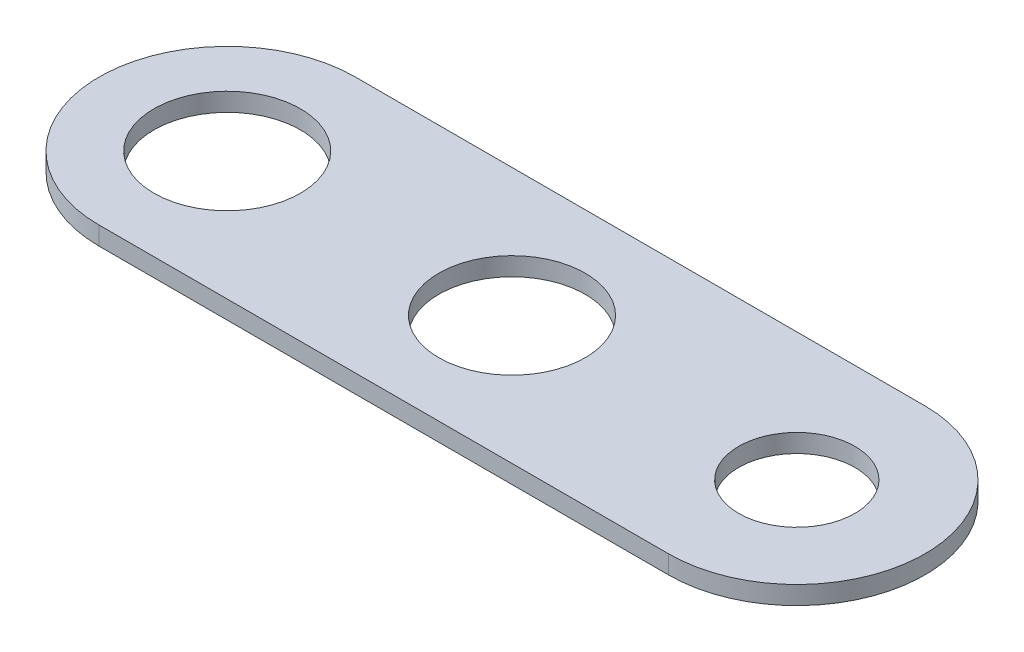
ISO-10303-21;
HEADER;
FILE_DESCRIPTION(('STEP AP214'),'2;1');
FILE_NAME('part.step','',(''),(''),'','','');
FILE_SCHEMA(('AUTOMOTIVE_DESIGN { 1 0 10303 214 1 1 1 1 }'));
ENDSEC;
DATA;
#1=APPLICATION_CONTEXT('core data for automotive mechanical design processes');
#2=APPLICATION_PROTOCOL_DEFINITION('international standard','automotive_design',2000,#1);
#3=PRODUCT_CONTEXT('',#1,'mechanical');
#4=PRODUCT('Part','Part','',(#3));
#5=PRODUCT_RELATED_PRODUCT_CATEGORY('part','',(#4));
#6=PRODUCT_DEFINITION_FORMATION('','',#4);
#7=PRODUCT_DEFINITION_CONTEXT('part definition',#1,'design');
#8=PRODUCT_DEFINITION('design','',#6,#7);
#9=PRODUCT_DEFINITION_SHAPE('','',#8);
#10=(LENGTH_UNIT() NAMED_UNIT(*) SI_UNIT(.MILLI.,.METRE.));
#11=(NAMED_UNIT(*) PLANE_ANGLE_UNIT() SI_UNIT($,.RADIAN.));
#12=(NAMED_UNIT(*) SI_UNIT($,.STERADIAN.) SOLID_ANGLE_UNIT());
#13=UNCERTAINTY_MEASURE_WITH_UNIT(LENGTH_MEASURE(1.E-05),#10,'distance_accuracy_value','');
#14=(GEOMETRIC_REPRESENTATION_CONTEXT(3) GLOBAL_UNCERTAINTY_ASSIGNED_CONTEXT((#13)) GLOBAL_UNIT_ASSIGNED_CONTEXT((#10,
#11,#12)) REPRESENTATION_CONTEXT('',''));
#15=CARTESIAN_POINT('',(0.,0.,0.));
#16=DIRECTION('',(0.,0.,1.));
#17=DIRECTION('',(1.,0.,0.));
#18=AXIS2_PLACEMENT_3D('',#15,#16,#17);
#19=CARTESIAN_POINT('',(-15.555,1.,0.));
#20=DIRECTION('',(0.,1.,0.));
#21=DIRECTION('',(0.,0.,1.));
#22=AXIS2_PLACEMENT_3D('',#19,#20,#21);
#23=PLANE('',#22);
#24=CARTESIAN_POINT('',(0.,1.,0.));
#25=DIRECTION('',(0.,1.,0.));
#26=DIRECTION('',(0.,0.,1.));
#27=AXIS2_PLACEMENT_3D('',#24,#25,#26);
#28=CIRCLE('',#27,4.);
#29=CARTESIAN_POINT('',(0.,1.,4.));
#30=VERTEX_POINT('',#29);
#31=EDGE_CURVE('E115',#30,#30,#28,.T.);
#32=ORIENTED_EDGE('',*,*,#31,.F.);
#33=EDGE_LOOP('',(#32));
#34=FACE_BOUND('',#33,.T.);
#35=CARTESIAN_POINT('',(-15.555,1.,0.));
#36=DIRECTION('',(0.,1.,0.));
#37=DIRECTION('',(0.,0.,1.));
#38=AXIS2_PLACEMENT_3D('',#35,#36,#37);
#39=CIRCLE('',#38,7.);
#40=CARTESIAN_POINT('',(-15.555,1.,-7.));
#41=VERTEX_POINT('',#40);
#42=CARTESIAN_POINT('',(-15.555,1.,7.));
#43=VERTEX_POINT('',#42);
#44=EDGE_CURVE('E85',#41,#43,#39,.T.);
#45=ORIENTED_EDGE('',*,*,#44,.T.);
#46=DIRECTION('',(1.,0.,0.));
#47=VECTOR('',#46,1.);
#48=CARTESIAN_POINT('',(-15.555,1.,7.));
#49=LINE('',#48,#47);
#50=CARTESIAN_POINT('',(15.555,1.,6.99999999999999));
#51=VERTEX_POINT('',#50);
#52=EDGE_CURVE('E80',#43,#51,#49,.T.);
#53=ORIENTED_EDGE('',*,*,#52,.T.);
#54=CARTESIAN_POINT('',(15.555,1.,0.));
#55=DIRECTION('',(0.,1.,0.));
#56=DIRECTION('',(0.,0.,1.));
#57=AXIS2_PLACEMENT_3D('',#54,#55,#56);
#58=CIRCLE('',#57,7.);
#59=CARTESIAN_POINT('',(15.555,1.,-7.00000000000001));
#60=VERTEX_POINT('',#59);
#61=EDGE_CURVE('E83',#51,#60,#58,.T.);
#62=ORIENTED_EDGE('',*,*,#61,.T.);
#63=DIRECTION('',(-1.,0.,0.));
#64=VECTOR('',#63,1.);
#65=CARTESIAN_POINT('',(-15.555,1.,-7.));
#66=LINE('',#65,#64);
#67=EDGE_CURVE('E50',#60,#41,#66,.T.);
#68=ORIENTED_EDGE('',*,*,#67,.T.);
#69=EDGE_LOOP('',(#45,#53,#62,#68));
#70=FACE_BOUND('',#69,.T.);
#71=CARTESIAN_POINT('',(-15.555,1.,0.));
#72=DIRECTION('',(0.,1.,0.));
#73=DIRECTION('',(0.,0.,1.));
#74=AXIS2_PLACEMENT_3D('',#71,#72,#73);
#75=CIRCLE('',#74,4.);
#76=CARTESIAN_POINT('',(-15.555,1.,4.));
#77=VERTEX_POINT('',#76);
#78=EDGE_CURVE('E100',#77,#77,#75,.T.);
#79=ORIENTED_EDGE('',*,*,#78,.F.);
#80=EDGE_LOOP('',(#79));
#81=FACE_BOUND('',#80,.T.);
#82=CARTESIAN_POINT('',(15.555,1.,0.));
#83=DIRECTION('',(0.,1.,0.));
#84=DIRECTION('',(0.,0.,1.));
#85=AXIS2_PLACEMENT_3D('',#82,#83,#84);
#86=CIRCLE('',#85,3.175);
#87=CARTESIAN_POINT('',(15.555,1.,3.175));
#88=VERTEX_POINT('',#87);
#89=EDGE_CURVE('E121',#88,#88,#86,.T.);
#90=ORIENTED_EDGE('',*,*,#89,.F.);
#91=EDGE_LOOP('',(#90));
#92=FACE_BOUND('',#91,.T.);
#93=ADVANCED_FACE('F33',(#34,#70,#81,#92),#23,.T.);
#94=CARTESIAN_POINT('',(-15.555,0.,0.));
#95=DIRECTION('',(0.,1.,0.));
#96=DIRECTION('',(0.,0.,1.));
#97=AXIS2_PLACEMENT_3D('',#94,#95,#96);
#98=PLANE('',#97);
#99=CARTESIAN_POINT('',(-15.555,0.,0.));
#100=DIRECTION('',(0.,1.,0.));
#101=DIRECTION('',(0.,0.,1.));
#102=AXIS2_PLACEMENT_3D('',#99,#100,#101);
#103=CIRCLE('',#102,7.);
#104=CARTESIAN_POINT('',(-15.555,0.,-7.));
#105=VERTEX_POINT('',#104);
#106=CARTESIAN_POINT('',(-15.555,0.,7.));
#107=VERTEX_POINT('',#106);
#108=EDGE_CURVE('E97',#105,#107,#103,.T.);
#109=ORIENTED_EDGE('',*,*,#108,.F.);
#110=DIRECTION('',(-1.,0.,0.));
#111=VECTOR('',#110,1.);
#112=CARTESIAN_POINT('',(-15.555,0.,-7.));
#113=LINE('',#112,#111);
#114=CARTESIAN_POINT('',(15.555,0.,-7.00000000000001));
#115=VERTEX_POINT('',#114);
#116=EDGE_CURVE('E73',#115,#105,#113,.T.);
#117=ORIENTED_EDGE('',*,*,#116,.F.);
#118=CARTESIAN_POINT('',(15.555,0.,0.));
#119=DIRECTION('',(0.,1.,0.));
#120=DIRECTION('',(0.,0.,1.));
#121=AXIS2_PLACEMENT_3D('',#118,#119,#120);
#122=CIRCLE('',#121,7.);
#123=CARTESIAN_POINT('',(15.555,0.,6.99999999999999));
#124=VERTEX_POINT('',#123);
#125=EDGE_CURVE('E67',#124,#115,#122,.T.);
#126=ORIENTED_EDGE('',*,*,#125,.F.);
#127=DIRECTION('',(1.,0.,0.));
#128=VECTOR('',#127,1.);
#129=CARTESIAN_POINT('',(-15.555,0.,7.));
#130=LINE('',#129,#128);
#131=EDGE_CURVE('E89',#107,#124,#130,.T.);
#132=ORIENTED_EDGE('',*,*,#131,.F.);
#133=EDGE_LOOP('',(#109,#117,#126,#132));
#134=FACE_BOUND('',#133,.T.);
#135=CARTESIAN_POINT('',(-15.555,0.,0.));
#136=DIRECTION('',(0.,1.,0.));
#137=DIRECTION('',(0.,0.,1.));
#138=AXIS2_PLACEMENT_3D('',#135,#136,#137);
#139=CIRCLE('',#138,4.);
#140=CARTESIAN_POINT('',(-15.555,0.,4.));
#141=VERTEX_POINT('',#140);
#142=EDGE_CURVE('E112',#141,#141,#139,.T.);
#143=ORIENTED_EDGE('',*,*,#142,.T.);
#144=EDGE_LOOP('',(#143));
#145=FACE_BOUND('',#144,.T.);
#146=CARTESIAN_POINT('',(0.,0.,0.));
#147=DIRECTION('',(0.,1.,0.));
#148=DIRECTION('',(0.,0.,1.));
#149=AXIS2_PLACEMENT_3D('',#146,#147,#148);
#150=CIRCLE('',#149,4.);
#151=CARTESIAN_POINT('',(0.,0.,4.));
#152=VERTEX_POINT('',#151);
#153=EDGE_CURVE('E118',#152,#152,#150,.T.);
#154=ORIENTED_EDGE('',*,*,#153,.T.);
#155=EDGE_LOOP('',(#154));
#156=FACE_BOUND('',#155,.T.);
#157=CARTESIAN_POINT('',(15.555,0.,0.));
#158=DIRECTION('',(0.,1.,0.));
#159=DIRECTION('',(0.,0.,1.));
#160=AXIS2_PLACEMENT_3D('',#157,#158,#159);
#161=CIRCLE('',#160,3.175);
#162=CARTESIAN_POINT('',(15.555,0.,3.175));
#163=VERTEX_POINT('',#162);
#164=EDGE_CURVE('E124',#163,#163,#161,.T.);
#165=ORIENTED_EDGE('',*,*,#164,.T.);
#166=EDGE_LOOP('',(#165));
#167=FACE_BOUND('',#166,.T.);
#168=ADVANCED_FACE('F108',(#134,#145,#156,#167),#98,.F.);
#169=CARTESIAN_POINT('',(-15.555,1.,0.));
#170=DIRECTION('',(0.,-1.,0.));
#171=DIRECTION('',(0.,0.,-1.));
#172=AXIS2_PLACEMENT_3D('',#169,#170,#171);
#173=CYLINDRICAL_SURFACE('',#172,7.);
#174=ORIENTED_EDGE('',*,*,#108,.T.);
#175=DIRECTION('',(0.,-1.,0.));
#176=VECTOR('',#175,1.);
#177=CARTESIAN_POINT('',(-15.555,1.,7.));
#178=LINE('',#177,#176);
#179=EDGE_CURVE('E11',#43,#107,#178,.T.);
#180=ORIENTED_EDGE('',*,*,#179,.F.);
#181=ORIENTED_EDGE('',*,*,#44,.F.);
#182=DIRECTION('',(0.,-1.,0.));
#183=VECTOR('',#182,1.);
#184=CARTESIAN_POINT('',(-15.555,1.,-7.));
#185=LINE('',#184,#183);
#186=EDGE_CURVE('E93',#41,#105,#185,.T.);
#187=ORIENTED_EDGE('',*,*,#186,.T.);
#188=EDGE_LOOP('',(#174,#180,#181,#187));
#189=FACE_BOUND('',#188,.T.);
#190=ADVANCED_FACE('F35',(#189),#173,.T.);
#191=CARTESIAN_POINT('',(-15.555,1.,7.));
#192=DIRECTION('',(0.,0.,-1.));
#193=DIRECTION('',(-1.,0.,0.));
#194=AXIS2_PLACEMENT_3D('',#191,#192,#193);
#195=PLANE('',#194);
#196=ORIENTED_EDGE('',*,*,#131,.T.);
#197=DIRECTION('',(0.,-1.,0.));
#198=VECTOR('',#197,1.);
#199=CARTESIAN_POINT('',(15.555,1.,6.99999999999999));
#200=LINE('',#199,#198);
#201=EDGE_CURVE('E42',#51,#124,#200,.T.);
#202=ORIENTED_EDGE('',*,*,#201,.F.);
#203=ORIENTED_EDGE('',*,*,#52,.F.);
#204=ORIENTED_EDGE('',*,*,#179,.T.);
#205=EDGE_LOOP('',(#196,#202,#203,#204));
#206=FACE_BOUND('',#205,.T.);
#207=ADVANCED_FACE('F88',(#206),#195,.F.);
#208=CARTESIAN_POINT('',(15.555,1.,0.));
#209=DIRECTION('',(0.,-1.,0.));
#210=DIRECTION('',(0.,0.,-1.));
#211=AXIS2_PLACEMENT_3D('',#208,#209,#210);
#212=CYLINDRICAL_SURFACE('',#211,7.);
#213=ORIENTED_EDGE('',*,*,#125,.T.);
#214=DIRECTION('',(0.,-1.,0.));
#215=VECTOR('',#214,1.);
#216=CARTESIAN_POINT('',(15.555,1.,-7.00000000000001));
#217=LINE('',#216,#215);
#218=EDGE_CURVE('E90',#60,#115,#217,.T.);
#219=ORIENTED_EDGE('',*,*,#218,.F.);
#220=ORIENTED_EDGE('',*,*,#61,.F.);
#221=ORIENTED_EDGE('',*,*,#201,.T.);
#222=EDGE_LOOP('',(#213,#219,#220,#221));
#223=FACE_BOUND('',#222,.T.);
#224=ADVANCED_FACE('F91',(#223),#212,.T.);
#225=CARTESIAN_POINT('',(-15.555,1.,-7.));
#226=DIRECTION('',(0.,0.,1.));
#227=DIRECTION('',(1.,0.,0.));
#228=AXIS2_PLACEMENT_3D('',#225,#226,#227);
#229=PLANE('',#228);
#230=ORIENTED_EDGE('',*,*,#116,.T.);
#231=ORIENTED_EDGE('',*,*,#186,.F.);
#232=ORIENTED_EDGE('',*,*,#67,.F.);
#233=ORIENTED_EDGE('',*,*,#218,.T.);
#234=EDGE_LOOP('',(#230,#231,#232,#233));
#235=FACE_BOUND('',#234,.T.);
#236=ADVANCED_FACE('F105',(#235),#229,.F.);
#237=CARTESIAN_POINT('',(-15.555,1.,0.));
#238=DIRECTION('',(0.,-1.,0.));
#239=DIRECTION('',(0.,0.,-1.));
#240=AXIS2_PLACEMENT_3D('',#237,#238,#239);
#241=CYLINDRICAL_SURFACE('',#240,4.);
#242=ORIENTED_EDGE('',*,*,#78,.T.);
#243=EDGE_LOOP('',(#242));
#244=FACE_BOUND('',#243,.T.);
#245=ORIENTED_EDGE('',*,*,#142,.F.);
#246=EDGE_LOOP('',(#245));
#247=FACE_BOUND('',#246,.T.);
#248=ADVANCED_FACE('F142',(#244,#247),#241,.F.);
#249=CARTESIAN_POINT('',(0.,1.,0.));
#250=DIRECTION('',(0.,-1.,0.));
#251=DIRECTION('',(0.,0.,-1.));
#252=AXIS2_PLACEMENT_3D('',#249,#250,#251);
#253=CYLINDRICAL_SURFACE('',#252,4.);
#254=ORIENTED_EDGE('',*,*,#31,.T.);
#255=EDGE_LOOP('',(#254));
#256=FACE_BOUND('',#255,.T.);
#257=ORIENTED_EDGE('',*,*,#153,.F.);
#258=EDGE_LOOP('',(#257));
#259=FACE_BOUND('',#258,.T.);
#260=ADVANCED_FACE('F188',(#256,#259),#253,.F.);
#261=CARTESIAN_POINT('',(15.555,1.,0.));
#262=DIRECTION('',(0.,-1.,0.));
#263=DIRECTION('',(0.,0.,-1.));
#264=AXIS2_PLACEMENT_3D('',#261,#262,#263);
#265=CYLINDRICAL_SURFACE('',#264,3.175);
#266=ORIENTED_EDGE('',*,*,#89,.T.);
#267=EDGE_LOOP('',(#266));
#268=FACE_BOUND('',#267,.T.);
#269=ORIENTED_EDGE('',*,*,#164,.F.);
#270=EDGE_LOOP('',(#269));
#271=FACE_BOUND('',#270,.T.);
#272=ADVANCED_FACE('F130',(#268,#271),#265,.F.);
#273=CLOSED_SHELL('',(#93,#168,#190,#207,#224,#236,#248,#260,#272));
#274=MANIFOLD_SOLID_BREP('B2',#273);
#275=ADVANCED_BREP_SHAPE_REPRESENTATION('',(#18,#274),#14);
#276=SHAPE_DEFINITION_REPRESENTATION(#9,#275);
ENDSEC;
END-ISO-10303-21;
